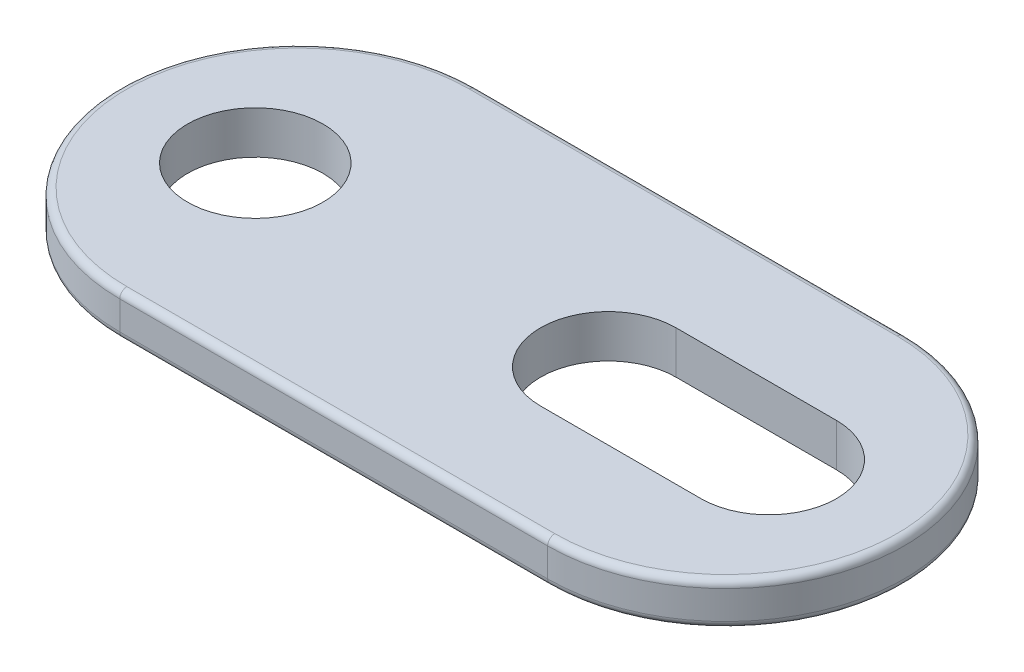
ISO-10303-21;
HEADER;
FILE_DESCRIPTION(('STEP AP214'),'2;1');
FILE_NAME('part.step','',(''),(''),'','','');
FILE_SCHEMA(('AUTOMOTIVE_DESIGN { 1 0 10303 214 1 1 1 1 }'));
ENDSEC;
DATA;
#1=APPLICATION_CONTEXT('core data for automotive mechanical design processes');
#2=APPLICATION_PROTOCOL_DEFINITION('international standard','automotive_design',2000,#1);
#3=PRODUCT_CONTEXT('',#1,'mechanical');
#4=PRODUCT('Part','Part','',(#3));
#5=PRODUCT_RELATED_PRODUCT_CATEGORY('part','',(#4));
#6=PRODUCT_DEFINITION_FORMATION('','',#4);
#7=PRODUCT_DEFINITION_CONTEXT('part definition',#1,'design');
#8=PRODUCT_DEFINITION('design','',#6,#7);
#9=PRODUCT_DEFINITION_SHAPE('','',#8);
#10=(LENGTH_UNIT() NAMED_UNIT(*) SI_UNIT(.MILLI.,.METRE.));
#11=(NAMED_UNIT(*) PLANE_ANGLE_UNIT() SI_UNIT($,.RADIAN.));
#12=(NAMED_UNIT(*) SI_UNIT($,.STERADIAN.) SOLID_ANGLE_UNIT());
#13=UNCERTAINTY_MEASURE_WITH_UNIT(LENGTH_MEASURE(1.E-05),#10,'distance_accuracy_value','');
#14=(GEOMETRIC_REPRESENTATION_CONTEXT(3) GLOBAL_UNCERTAINTY_ASSIGNED_CONTEXT((#13)) GLOBAL_UNIT_ASSIGNED_CONTEXT((#10,
#11,#12)) REPRESENTATION_CONTEXT('',''));
#15=CARTESIAN_POINT('',(0.,0.,0.));
#16=DIRECTION('',(0.,0.,1.));
#17=DIRECTION('',(1.,0.,0.));
#18=AXIS2_PLACEMENT_3D('',#15,#16,#17);
#19=CARTESIAN_POINT('',(1.524,0.762,0.));
#20=DIRECTION('',(0.,1.,0.));
#21=DIRECTION('',(0.,0.,1.));
#22=AXIS2_PLACEMENT_3D('',#19,#20,#21);
#23=PLANE('',#22);
#24=DIRECTION('',(-1.,0.,0.));
#25=VECTOR('',#24,1.);
#26=CARTESIAN_POINT('',(1.524,0.762,-6.096));
#27=LINE('',#26,#25);
#28=CARTESIAN_POINT('',(16.764,0.762,-6.096));
#29=VERTEX_POINT('',#28);
#30=CARTESIAN_POINT('',(1.524,0.762,-6.096));
#31=VERTEX_POINT('',#30);
#32=EDGE_CURVE('E49',#29,#31,#27,.T.);
#33=ORIENTED_EDGE('',*,*,#32,.T.);
#34=CARTESIAN_POINT('',(1.524,0.762,0.));
#35=DIRECTION('',(0.,1.,0.));
#36=DIRECTION('',(0.,0.,1.));
#37=AXIS2_PLACEMENT_3D('',#34,#35,#36);
#38=CIRCLE('',#37,6.096);
#39=CARTESIAN_POINT('',(1.524,0.762,6.096));
#40=VERTEX_POINT('',#39);
#41=EDGE_CURVE('E214',#31,#40,#38,.T.);
#42=ORIENTED_EDGE('',*,*,#41,.T.);
#43=DIRECTION('',(1.,0.,0.));
#44=VECTOR('',#43,1.);
#45=CARTESIAN_POINT('',(16.764,0.762,6.096));
#46=LINE('',#45,#44);
#47=CARTESIAN_POINT('',(16.764,0.762,6.096));
#48=VERTEX_POINT('',#47);
#49=EDGE_CURVE('E210',#40,#48,#46,.T.);
#50=ORIENTED_EDGE('',*,*,#49,.T.);
#51=CARTESIAN_POINT('',(16.764,0.762,0.));
#52=DIRECTION('',(0.,1.,0.));
#53=DIRECTION('',(0.,0.,1.));
#54=AXIS2_PLACEMENT_3D('',#51,#52,#53);
#55=CIRCLE('',#54,6.096);
#56=EDGE_CURVE('E54',#48,#29,#55,.T.);
#57=ORIENTED_EDGE('',*,*,#56,.T.);
#58=EDGE_LOOP('',(#33,#42,#50,#57));
#59=FACE_BOUND('',#58,.T.);
#60=CARTESIAN_POINT('',(0.,0.762,0.));
#61=DIRECTION('',(0.,1.,0.));
#62=DIRECTION('',(0.,0.,1.));
#63=AXIS2_PLACEMENT_3D('',#60,#61,#62);
#64=CIRCLE('',#63,2.413);
#65=CARTESIAN_POINT('',(0.,0.762,-2.413));
#66=VERTEX_POINT('',#65);
#67=EDGE_CURVE('E172',#66,#66,#64,.T.);
#68=ORIENTED_EDGE('',*,*,#67,.F.);
#69=EDGE_LOOP('',(#68));
#70=FACE_BOUND('',#69,.T.);
#71=DIRECTION('',(1.,0.,0.));
#72=VECTOR('',#71,1.);
#73=CARTESIAN_POINT('',(12.573,0.762,2.413));
#74=LINE('',#73,#72);
#75=CARTESIAN_POINT('',(12.573,0.762,2.413));
#76=VERTEX_POINT('',#75);
#77=CARTESIAN_POINT('',(18.288,0.762,2.413));
#78=VERTEX_POINT('',#77);
#79=EDGE_CURVE('E158',#76,#78,#74,.T.);
#80=ORIENTED_EDGE('',*,*,#79,.F.);
#81=CARTESIAN_POINT('',(12.573,0.762,0.));
#82=DIRECTION('',(0.,1.,0.));
#83=DIRECTION('',(0.,0.,1.));
#84=AXIS2_PLACEMENT_3D('',#81,#82,#83);
#85=CIRCLE('',#84,2.413);
#86=CARTESIAN_POINT('',(12.573,0.762,-2.413));
#87=VERTEX_POINT('',#86);
#88=EDGE_CURVE('E141',#87,#76,#85,.T.);
#89=ORIENTED_EDGE('',*,*,#88,.F.);
#90=DIRECTION('',(-1.,0.,0.));
#91=VECTOR('',#90,1.);
#92=CARTESIAN_POINT('',(12.573,0.762,-2.413));
#93=LINE('',#92,#91);
#94=CARTESIAN_POINT('',(18.288,0.762,-2.413));
#95=VERTEX_POINT('',#94);
#96=EDGE_CURVE('E163',#95,#87,#93,.T.);
#97=ORIENTED_EDGE('',*,*,#96,.F.);
#98=CARTESIAN_POINT('',(18.288,0.762,0.));
#99=DIRECTION('',(0.,1.,0.));
#100=DIRECTION('',(0.,0.,1.));
#101=AXIS2_PLACEMENT_3D('',#98,#99,#100);
#102=CIRCLE('',#101,2.413);
#103=EDGE_CURVE('E160',#78,#95,#102,.T.);
#104=ORIENTED_EDGE('',*,*,#103,.F.);
#105=EDGE_LOOP('',(#80,#89,#97,#104));
#106=FACE_BOUND('',#105,.T.);
#107=ADVANCED_FACE('F34',(#59,#70,#106),#23,.T.);
#108=CARTESIAN_POINT('',(1.524,-0.762,0.));
#109=DIRECTION('',(0.,1.,0.));
#110=DIRECTION('',(0.,0.,1.));
#111=AXIS2_PLACEMENT_3D('',#108,#109,#110);
#112=PLANE('',#111);
#113=DIRECTION('',(1.,0.,0.));
#114=VECTOR('',#113,1.);
#115=CARTESIAN_POINT('',(1.524,-0.762,6.096));
#116=LINE('',#115,#114);
#117=CARTESIAN_POINT('',(16.764,-0.762,6.096));
#118=VERTEX_POINT('',#117);
#119=CARTESIAN_POINT('',(1.524,-0.762,6.096));
#120=VERTEX_POINT('',#119);
#121=EDGE_CURVE('E193',#118,#120,#116,.F.);
#122=ORIENTED_EDGE('',*,*,#121,.T.);
#123=CARTESIAN_POINT('',(1.524,-0.762,0.));
#124=DIRECTION('',(0.,1.,0.));
#125=DIRECTION('',(0.,0.,1.));
#126=AXIS2_PLACEMENT_3D('',#123,#124,#125);
#127=CIRCLE('',#126,6.096);
#128=CARTESIAN_POINT('',(1.524,-0.762,-6.096));
#129=VERTEX_POINT('',#128);
#130=EDGE_CURVE('E199',#120,#129,#127,.F.);
#131=ORIENTED_EDGE('',*,*,#130,.T.);
#132=DIRECTION('',(-1.,0.,0.));
#133=VECTOR('',#132,1.);
#134=CARTESIAN_POINT('',(1.524,-0.762,-6.096));
#135=LINE('',#134,#133);
#136=CARTESIAN_POINT('',(16.764,-0.762,-6.096));
#137=VERTEX_POINT('',#136);
#138=EDGE_CURVE('E197',#129,#137,#135,.F.);
#139=ORIENTED_EDGE('',*,*,#138,.T.);
#140=CARTESIAN_POINT('',(16.764,-0.762,0.));
#141=DIRECTION('',(0.,1.,0.));
#142=DIRECTION('',(0.,0.,1.));
#143=AXIS2_PLACEMENT_3D('',#140,#141,#142);
#144=CIRCLE('',#143,6.096);
#145=EDGE_CURVE('E195',#137,#118,#144,.F.);
#146=ORIENTED_EDGE('',*,*,#145,.T.);
#147=EDGE_LOOP('',(#122,#131,#139,#146));
#148=FACE_BOUND('',#147,.T.);
#149=CARTESIAN_POINT('',(0.,-0.762,0.));
#150=DIRECTION('',(0.,1.,0.));
#151=DIRECTION('',(0.,0.,1.));
#152=AXIS2_PLACEMENT_3D('',#149,#150,#151);
#153=CIRCLE('',#152,2.413);
#154=CARTESIAN_POINT('',(0.,-0.762,-2.413));
#155=VERTEX_POINT('',#154);
#156=EDGE_CURVE('E142',#155,#155,#153,.T.);
#157=ORIENTED_EDGE('',*,*,#156,.T.);
#158=EDGE_LOOP('',(#157));
#159=FACE_BOUND('',#158,.T.);
#160=CARTESIAN_POINT('',(12.573,-0.762,0.));
#161=DIRECTION('',(0.,1.,0.));
#162=DIRECTION('',(0.,0.,1.));
#163=AXIS2_PLACEMENT_3D('',#160,#161,#162);
#164=CIRCLE('',#163,2.413);
#165=CARTESIAN_POINT('',(12.573,-0.762,-2.413));
#166=VERTEX_POINT('',#165);
#167=CARTESIAN_POINT('',(12.573,-0.762,2.413));
#168=VERTEX_POINT('',#167);
#169=EDGE_CURVE('E134',#166,#168,#164,.T.);
#170=ORIENTED_EDGE('',*,*,#169,.T.);
#171=DIRECTION('',(1.,0.,0.));
#172=VECTOR('',#171,1.);
#173=CARTESIAN_POINT('',(12.573,-0.762,2.413));
#174=LINE('',#173,#172);
#175=CARTESIAN_POINT('',(18.288,-0.762,2.413));
#176=VERTEX_POINT('',#175);
#177=EDGE_CURVE('E122',#168,#176,#174,.T.);
#178=ORIENTED_EDGE('',*,*,#177,.T.);
#179=CARTESIAN_POINT('',(18.288,-0.762,0.));
#180=DIRECTION('',(0.,1.,0.));
#181=DIRECTION('',(0.,0.,1.));
#182=AXIS2_PLACEMENT_3D('',#179,#180,#181);
#183=CIRCLE('',#182,2.413);
#184=CARTESIAN_POINT('',(18.288,-0.762,-2.413));
#185=VERTEX_POINT('',#184);
#186=EDGE_CURVE('E133',#176,#185,#183,.T.);
#187=ORIENTED_EDGE('',*,*,#186,.T.);
#188=DIRECTION('',(-1.,0.,0.));
#189=VECTOR('',#188,1.);
#190=CARTESIAN_POINT('',(12.573,-0.762,-2.413));
#191=LINE('',#190,#189);
#192=EDGE_CURVE('E147',#185,#166,#191,.T.);
#193=ORIENTED_EDGE('',*,*,#192,.T.);
#194=EDGE_LOOP('',(#170,#178,#187,#193));
#195=FACE_BOUND('',#194,.T.);
#196=ADVANCED_FACE('F145',(#148,#159,#195),#112,.F.);
#197=CARTESIAN_POINT('',(1.524,0.762,0.));
#198=DIRECTION('',(0.,-1.,0.));
#199=DIRECTION('',(0.,0.,-1.));
#200=AXIS2_PLACEMENT_3D('',#197,#198,#199);
#201=CYLINDRICAL_SURFACE('',#200,6.35);
#202=DIRECTION('',(0.,-1.,0.));
#203=VECTOR('',#202,1.);
#204=CARTESIAN_POINT('',(1.524,0.762,-6.35));
#205=LINE('',#204,#203);
#206=CARTESIAN_POINT('',(1.524,0.508,-6.35));
#207=VERTEX_POINT('',#206);
#208=CARTESIAN_POINT('',(1.524,-0.507999999999999,-6.35));
#209=VERTEX_POINT('',#208);
#210=EDGE_CURVE('E175',#207,#209,#205,.T.);
#211=ORIENTED_EDGE('',*,*,#210,.T.);
#212=CARTESIAN_POINT('',(1.524,-0.508,0.));
#213=DIRECTION('',(0.,1.,0.));
#214=DIRECTION('',(0.,0.,1.));
#215=AXIS2_PLACEMENT_3D('',#212,#213,#214);
#216=CIRCLE('',#215,6.35);
#217=CARTESIAN_POINT('',(1.524,-0.507999999999999,6.35));
#218=VERTEX_POINT('',#217);
#219=EDGE_CURVE('E190',#209,#218,#216,.T.);
#220=ORIENTED_EDGE('',*,*,#219,.T.);
#221=DIRECTION('',(0.,-1.,0.));
#222=VECTOR('',#221,1.);
#223=CARTESIAN_POINT('',(1.524,0.762,6.35));
#224=LINE('',#223,#222);
#225=CARTESIAN_POINT('',(1.524,0.508,6.35));
#226=VERTEX_POINT('',#225);
#227=EDGE_CURVE('E184',#226,#218,#224,.T.);
#228=ORIENTED_EDGE('',*,*,#227,.F.);
#229=CARTESIAN_POINT('',(1.524,0.508,0.));
#230=DIRECTION('',(0.,1.,0.));
#231=DIRECTION('',(0.,0.,1.));
#232=AXIS2_PLACEMENT_3D('',#229,#230,#231);
#233=CIRCLE('',#232,6.35);
#234=EDGE_CURVE('E187',#226,#207,#233,.F.);
#235=ORIENTED_EDGE('',*,*,#234,.T.);
#236=EDGE_LOOP('',(#211,#220,#228,#235));
#237=FACE_BOUND('',#236,.T.);
#238=ADVANCED_FACE('F36',(#237),#201,.T.);
#239=CARTESIAN_POINT('',(1.524,0.762,6.35));
#240=DIRECTION('',(0.,0.,-1.));
#241=DIRECTION('',(-1.,0.,0.));
#242=AXIS2_PLACEMENT_3D('',#239,#240,#241);
#243=PLANE('',#242);
#244=ORIENTED_EDGE('',*,*,#227,.T.);
#245=DIRECTION('',(1.,0.,0.));
#246=VECTOR('',#245,1.);
#247=CARTESIAN_POINT('',(1.524,-0.508,6.35));
#248=LINE('',#247,#246);
#249=CARTESIAN_POINT('',(16.764,-0.507999999999999,6.35));
#250=VERTEX_POINT('',#249);
#251=EDGE_CURVE('E11',#218,#250,#248,.T.);
#252=ORIENTED_EDGE('',*,*,#251,.T.);
#253=DIRECTION('',(0.,-1.,0.));
#254=VECTOR('',#253,1.);
#255=CARTESIAN_POINT('',(16.764,0.762,6.35));
#256=LINE('',#255,#254);
#257=CARTESIAN_POINT('',(16.764,0.508,6.35));
#258=VERTEX_POINT('',#257);
#259=EDGE_CURVE('E181',#258,#250,#256,.T.);
#260=ORIENTED_EDGE('',*,*,#259,.F.);
#261=DIRECTION('',(1.,0.,0.));
#262=VECTOR('',#261,1.);
#263=CARTESIAN_POINT('',(1.524,0.508,6.35));
#264=LINE('',#263,#262);
#265=EDGE_CURVE('E42',#258,#226,#264,.F.);
#266=ORIENTED_EDGE('',*,*,#265,.T.);
#267=EDGE_LOOP('',(#244,#252,#260,#266));
#268=FACE_BOUND('',#267,.T.);
#269=ADVANCED_FACE('F219',(#268),#243,.F.);
#270=CARTESIAN_POINT('',(16.764,0.762,0.));
#271=DIRECTION('',(0.,-1.,0.));
#272=DIRECTION('',(0.,0.,-1.));
#273=AXIS2_PLACEMENT_3D('',#270,#271,#272);
#274=CYLINDRICAL_SURFACE('',#273,6.35);
#275=ORIENTED_EDGE('',*,*,#259,.T.);
#276=CARTESIAN_POINT('',(16.764,-0.508,0.));
#277=DIRECTION('',(0.,1.,0.));
#278=DIRECTION('',(0.,0.,1.));
#279=AXIS2_PLACEMENT_3D('',#276,#277,#278);
#280=CIRCLE('',#279,6.35);
#281=CARTESIAN_POINT('',(16.764,-0.507999999999999,-6.35));
#282=VERTEX_POINT('',#281);
#283=EDGE_CURVE('E208',#250,#282,#280,.T.);
#284=ORIENTED_EDGE('',*,*,#283,.T.);
#285=DIRECTION('',(0.,-1.,0.));
#286=VECTOR('',#285,1.);
#287=CARTESIAN_POINT('',(16.764,0.762,-6.35));
#288=LINE('',#287,#286);
#289=CARTESIAN_POINT('',(16.764,0.508,-6.35));
#290=VERTEX_POINT('',#289);
#291=EDGE_CURVE('E178',#290,#282,#288,.T.);
#292=ORIENTED_EDGE('',*,*,#291,.F.);
#293=CARTESIAN_POINT('',(16.764,0.508,0.));
#294=DIRECTION('',(0.,1.,0.));
#295=DIRECTION('',(0.,0.,1.));
#296=AXIS2_PLACEMENT_3D('',#293,#294,#295);
#297=CIRCLE('',#296,6.35);
#298=EDGE_CURVE('E206',#290,#258,#297,.F.);
#299=ORIENTED_EDGE('',*,*,#298,.T.);
#300=EDGE_LOOP('',(#275,#284,#292,#299));
#301=FACE_BOUND('',#300,.T.);
#302=ADVANCED_FACE('F262',(#301),#274,.T.);
#303=CARTESIAN_POINT('',(1.524,0.762,-6.35));
#304=DIRECTION('',(0.,0.,1.));
#305=DIRECTION('',(1.,0.,0.));
#306=AXIS2_PLACEMENT_3D('',#303,#304,#305);
#307=PLANE('',#306);
#308=ORIENTED_EDGE('',*,*,#291,.T.);
#309=DIRECTION('',(-1.,0.,0.));
#310=VECTOR('',#309,1.);
#311=CARTESIAN_POINT('',(1.524,-0.508,-6.35));
#312=LINE('',#311,#310);
#313=EDGE_CURVE('E204',#282,#209,#312,.T.);
#314=ORIENTED_EDGE('',*,*,#313,.T.);
#315=ORIENTED_EDGE('',*,*,#210,.F.);
#316=DIRECTION('',(-1.,0.,0.));
#317=VECTOR('',#316,1.);
#318=CARTESIAN_POINT('',(16.764,0.508,-6.35));
#319=LINE('',#318,#317);
#320=EDGE_CURVE('E202',#207,#290,#319,.F.);
#321=ORIENTED_EDGE('',*,*,#320,.T.);
#322=EDGE_LOOP('',(#308,#314,#315,#321));
#323=FACE_BOUND('',#322,.T.);
#324=ADVANCED_FACE('F265',(#323),#307,.F.);
#325=CARTESIAN_POINT('',(0.,0.762,0.));
#326=DIRECTION('',(0.,-1.,0.));
#327=DIRECTION('',(0.,0.,-1.));
#328=AXIS2_PLACEMENT_3D('',#325,#326,#327);
#329=CYLINDRICAL_SURFACE('',#328,2.413);
#330=CARTESIAN_POINT('',(0.,0.762,-2.413));
#331=CARTESIAN_POINT('',(0.,0.746125,-2.413));
#332=CARTESIAN_POINT('',(0.,0.73025,-2.413));
#333=CARTESIAN_POINT('',(0.,0.6985,-2.413));
#334=CARTESIAN_POINT('',(0.,0.682625,-2.413));
#335=CARTESIAN_POINT('',(0.,0.650875,-2.413));
#336=CARTESIAN_POINT('',(0.,0.635,-2.413));
#337=CARTESIAN_POINT('',(0.,0.60325,-2.413));
#338=CARTESIAN_POINT('',(0.,0.587375,-2.413));
#339=CARTESIAN_POINT('',(0.,0.555625,-2.413));
#340=CARTESIAN_POINT('',(0.,0.53975,-2.413));
#341=CARTESIAN_POINT('',(0.,0.508,-2.413));
#342=CARTESIAN_POINT('',(0.,0.492125,-2.413));
#343=CARTESIAN_POINT('',(0.,0.460375,-2.413));
#344=CARTESIAN_POINT('',(0.,0.4445,-2.413));
#345=CARTESIAN_POINT('',(0.,0.41275,-2.413));
#346=CARTESIAN_POINT('',(0.,0.396875,-2.413));
#347=CARTESIAN_POINT('',(0.,0.365125,-2.413));
#348=CARTESIAN_POINT('',(0.,0.34925,-2.413));
#349=CARTESIAN_POINT('',(0.,0.3175,-2.413));
#350=CARTESIAN_POINT('',(0.,0.301625,-2.413));
#351=CARTESIAN_POINT('',(0.,0.269875,-2.413));
#352=CARTESIAN_POINT('',(0.,0.254,-2.413));
#353=CARTESIAN_POINT('',(0.,0.22225,-2.413));
#354=CARTESIAN_POINT('',(0.,0.206375,-2.413));
#355=CARTESIAN_POINT('',(0.,0.174625,-2.413));
#356=CARTESIAN_POINT('',(0.,0.15875,-2.413));
#357=CARTESIAN_POINT('',(0.,0.127,-2.413));
#358=CARTESIAN_POINT('',(0.,0.111125,-2.413));
#359=CARTESIAN_POINT('',(0.,0.0793749999999999,-2.413));
#360=CARTESIAN_POINT('',(0.,0.0634999999999999,-2.413));
#361=CARTESIAN_POINT('',(0.,0.0317499999999999,-2.413));
#362=CARTESIAN_POINT('',(0.,0.0158749999999999,-2.413));
#363=CARTESIAN_POINT('',(0.,-0.0158750000000001,-2.413));
#364=CARTESIAN_POINT('',(0.,-0.0317500000000001,-2.413));
#365=CARTESIAN_POINT('',(0.,-0.0635000000000002,-2.413));
#366=CARTESIAN_POINT('',(0.,-0.0793750000000002,-2.413));
#367=CARTESIAN_POINT('',(0.,-0.111125,-2.413));
#368=CARTESIAN_POINT('',(0.,-0.127,-2.413));
#369=CARTESIAN_POINT('',(0.,-0.15875,-2.413));
#370=CARTESIAN_POINT('',(0.,-0.174625,-2.413));
#371=CARTESIAN_POINT('',(0.,-0.206375,-2.413));
#372=CARTESIAN_POINT('',(0.,-0.22225,-2.413));
#373=CARTESIAN_POINT('',(0.,-0.254,-2.413));
#374=CARTESIAN_POINT('',(0.,-0.269875,-2.413));
#375=CARTESIAN_POINT('',(0.,-0.301625,-2.413));
#376=CARTESIAN_POINT('',(0.,-0.3175,-2.413));
#377=CARTESIAN_POINT('',(0.,-0.34925,-2.413));
#378=CARTESIAN_POINT('',(0.,-0.365125,-2.413));
#379=CARTESIAN_POINT('',(0.,-0.396875,-2.413));
#380=CARTESIAN_POINT('',(0.,-0.41275,-2.413));
#381=CARTESIAN_POINT('',(0.,-0.4445,-2.413));
#382=CARTESIAN_POINT('',(0.,-0.460375,-2.413));
#383=CARTESIAN_POINT('',(0.,-0.492125,-2.413));
#384=CARTESIAN_POINT('',(0.,-0.508,-2.413));
#385=CARTESIAN_POINT('',(0.,-0.53975,-2.413));
#386=CARTESIAN_POINT('',(0.,-0.555625,-2.413));
#387=CARTESIAN_POINT('',(0.,-0.587375,-2.413));
#388=CARTESIAN_POINT('',(0.,-0.60325,-2.413));
#389=CARTESIAN_POINT('',(0.,-0.635,-2.413));
#390=CARTESIAN_POINT('',(0.,-0.650875,-2.413));
#391=CARTESIAN_POINT('',(0.,-0.682625,-2.413));
#392=CARTESIAN_POINT('',(0.,-0.6985,-2.413));
#393=CARTESIAN_POINT('',(0.,-0.73025,-2.413));
#394=CARTESIAN_POINT('',(0.,-0.746125,-2.413));
#395=CARTESIAN_POINT('',(0.,-0.762,-2.413));
#396=B_SPLINE_CURVE_WITH_KNOTS('',3,(#330,#331,#332,#333,#334,#335,#336,#337,#338,#339,#340,
#341,#342,#343,#344,#345,#346,#347,#348,#349,#350,#351,#352,#353,#354,#355,#356,#357,#358,#359,
#360,#361,#362,#363,#364,#365,#366,#367,#368,#369,#370,#371,#372,#373,#374,#375,#376,#377,#378,
#379,#380,#381,#382,#383,#384,#385,#386,#387,#388,#389,#390,#391,#392,#393,#394,#395),
.UNSPECIFIED.,.F.,.F.,(4,2,2,2,2,2,2,2,2,2,2,2,2,2,2,2,2,2,2,2,2,2,2,2,2,2,2,2,2,2,2,2,4),(0.,
0.0476249999999999,0.09525,0.142875,0.1905,0.238125,0.28575,0.333375,0.381,0.428625,0.47625,
0.523875,0.5715,0.619125,0.66675,0.714375,0.762,0.809625,0.85725,0.904875,0.9525,1.000125,
1.04775,1.095375,1.143,1.190625,1.23825,1.285875,1.3335,1.381125,1.42875,1.476375,1.524),.UNSPECIFIED.);
#397=EDGE_CURVE('BSEAM292',#66,#155,#396,.T.);
#398=ORIENTED_EDGE('',*,*,#67,.T.);
#399=ORIENTED_EDGE('',*,*,#156,.F.);
#400=ORIENTED_EDGE('',*,*,#397,.T.);
#401=ORIENTED_EDGE('',*,*,#397,.F.);
#402=EDGE_LOOP('',(#398,#400,#399,#401));
#403=FACE_BOUND('',#402,.T.);
#404=ADVANCED_FACE('F292',(#403),#329,.F.);
#405=CARTESIAN_POINT('',(12.573,0.762,0.));
#406=DIRECTION('',(0.,-1.,0.));
#407=DIRECTION('',(0.,0.,-1.));
#408=AXIS2_PLACEMENT_3D('',#405,#406,#407);
#409=CYLINDRICAL_SURFACE('',#408,2.413);
#410=ORIENTED_EDGE('',*,*,#169,.F.);
#411=DIRECTION('',(0.,-1.,0.));
#412=VECTOR('',#411,1.);
#413=CARTESIAN_POINT('',(12.573,0.762,-2.413));
#414=LINE('',#413,#412);
#415=EDGE_CURVE('E165',#87,#166,#414,.T.);
#416=ORIENTED_EDGE('',*,*,#415,.F.);
#417=ORIENTED_EDGE('',*,*,#88,.T.);
#418=DIRECTION('',(0.,-1.,0.));
#419=VECTOR('',#418,1.);
#420=CARTESIAN_POINT('',(12.573,0.762,2.413));
#421=LINE('',#420,#419);
#422=EDGE_CURVE('E125',#76,#168,#421,.T.);
#423=ORIENTED_EDGE('',*,*,#422,.T.);
#424=EDGE_LOOP('',(#410,#416,#417,#423));
#425=FACE_BOUND('',#424,.T.);
#426=ADVANCED_FACE('F137',(#425),#409,.F.);
#427=CARTESIAN_POINT('',(12.573,0.762,2.413));
#428=DIRECTION('',(0.,0.,-1.));
#429=DIRECTION('',(-1.,0.,0.));
#430=AXIS2_PLACEMENT_3D('',#427,#428,#429);
#431=PLANE('',#430);
#432=ORIENTED_EDGE('',*,*,#177,.F.);
#433=ORIENTED_EDGE('',*,*,#422,.F.);
#434=ORIENTED_EDGE('',*,*,#79,.T.);
#435=DIRECTION('',(0.,-1.,0.));
#436=VECTOR('',#435,1.);
#437=CARTESIAN_POINT('',(18.288,0.762,2.413));
#438=LINE('',#437,#436);
#439=EDGE_CURVE('E128',#78,#176,#438,.T.);
#440=ORIENTED_EDGE('',*,*,#439,.T.);
#441=EDGE_LOOP('',(#432,#433,#434,#440));
#442=FACE_BOUND('',#441,.T.);
#443=ADVANCED_FACE('F124',(#442),#431,.T.);
#444=CARTESIAN_POINT('',(18.288,0.762,0.));
#445=DIRECTION('',(0.,-1.,0.));
#446=DIRECTION('',(0.,0.,-1.));
#447=AXIS2_PLACEMENT_3D('',#444,#445,#446);
#448=CYLINDRICAL_SURFACE('',#447,2.413);
#449=ORIENTED_EDGE('',*,*,#186,.F.);
#450=ORIENTED_EDGE('',*,*,#439,.F.);
#451=ORIENTED_EDGE('',*,*,#103,.T.);
#452=DIRECTION('',(0.,-1.,0.));
#453=VECTOR('',#452,1.);
#454=CARTESIAN_POINT('',(18.288,0.762,-2.413));
#455=LINE('',#454,#453);
#456=EDGE_CURVE('E167',#95,#185,#455,.T.);
#457=ORIENTED_EDGE('',*,*,#456,.T.);
#458=EDGE_LOOP('',(#449,#450,#451,#457));
#459=FACE_BOUND('',#458,.T.);
#460=ADVANCED_FACE('F318',(#459),#448,.F.);
#461=CARTESIAN_POINT('',(12.573,0.762,-2.413));
#462=DIRECTION('',(0.,0.,1.));
#463=DIRECTION('',(1.,0.,0.));
#464=AXIS2_PLACEMENT_3D('',#461,#462,#463);
#465=PLANE('',#464);
#466=ORIENTED_EDGE('',*,*,#192,.F.);
#467=ORIENTED_EDGE('',*,*,#456,.F.);
#468=ORIENTED_EDGE('',*,*,#96,.T.);
#469=ORIENTED_EDGE('',*,*,#415,.T.);
#470=EDGE_LOOP('',(#466,#467,#468,#469));
#471=FACE_BOUND('',#470,.T.);
#472=ADVANCED_FACE('F313',(#471),#465,.T.);
#473=CARTESIAN_POINT('',(16.764,-0.508,0.));
#474=DIRECTION('',(0.,1.,0.));
#475=DIRECTION('',(0.,0.,1.));
#476=AXIS2_PLACEMENT_3D('',#473,#474,#475);
#477=TOROIDAL_SURFACE('',#476,6.096,0.254);
#478=CARTESIAN_POINT('',(16.764,-0.508,6.096));
#479=DIRECTION('',(-1.,0.,0.));
#480=DIRECTION('',(0.,0.,1.));
#481=AXIS2_PLACEMENT_3D('',#478,#479,#480);
#482=CIRCLE('',#481,0.254);
#483=EDGE_CURVE('E151',#118,#250,#482,.T.);
#484=ORIENTED_EDGE('',*,*,#483,.F.);
#485=ORIENTED_EDGE('',*,*,#145,.F.);
#486=CARTESIAN_POINT('',(16.764,-0.508,-6.096));
#487=DIRECTION('',(-1.,0.,0.));
#488=DIRECTION('',(0.,0.,1.));
#489=AXIS2_PLACEMENT_3D('',#486,#487,#488);
#490=CIRCLE('',#489,0.254);
#491=EDGE_CURVE('E148',#282,#137,#490,.T.);
#492=ORIENTED_EDGE('',*,*,#491,.F.);
#493=ORIENTED_EDGE('',*,*,#283,.F.);
#494=EDGE_LOOP('',(#484,#485,#492,#493));
#495=FACE_BOUND('',#494,.T.);
#496=ADVANCED_FACE('F257',(#495),#477,.T.);
#497=CARTESIAN_POINT('',(1.524,-0.508,-6.096));
#498=DIRECTION('',(-1.,0.,0.));
#499=DIRECTION('',(0.,0.,1.));
#500=AXIS2_PLACEMENT_3D('',#497,#498,#499);
#501=CYLINDRICAL_SURFACE('',#500,0.254);
#502=ORIENTED_EDGE('',*,*,#491,.T.);
#503=ORIENTED_EDGE('',*,*,#138,.F.);
#504=CARTESIAN_POINT('',(1.524,-0.508,-6.096));
#505=DIRECTION('',(-1.,0.,0.));
#506=DIRECTION('',(0.,0.,1.));
#507=AXIS2_PLACEMENT_3D('',#504,#505,#506);
#508=CIRCLE('',#507,0.254);
#509=EDGE_CURVE('E246',#209,#129,#508,.T.);
#510=ORIENTED_EDGE('',*,*,#509,.F.);
#511=ORIENTED_EDGE('',*,*,#313,.F.);
#512=EDGE_LOOP('',(#502,#503,#510,#511));
#513=FACE_BOUND('',#512,.T.);
#514=ADVANCED_FACE('F379',(#513),#501,.T.);
#515=CARTESIAN_POINT('',(1.524,-0.508,6.096));
#516=DIRECTION('',(1.,0.,0.));
#517=DIRECTION('',(0.,0.,-1.));
#518=AXIS2_PLACEMENT_3D('',#515,#516,#517);
#519=CYLINDRICAL_SURFACE('',#518,0.254);
#520=ORIENTED_EDGE('',*,*,#483,.T.);
#521=ORIENTED_EDGE('',*,*,#251,.F.);
#522=CARTESIAN_POINT('',(1.524,-0.508,6.096));
#523=DIRECTION('',(-1.,0.,0.));
#524=DIRECTION('',(0.,0.,1.));
#525=AXIS2_PLACEMENT_3D('',#522,#523,#524);
#526=CIRCLE('',#525,0.254);
#527=EDGE_CURVE('E244',#120,#218,#526,.T.);
#528=ORIENTED_EDGE('',*,*,#527,.F.);
#529=ORIENTED_EDGE('',*,*,#121,.F.);
#530=EDGE_LOOP('',(#520,#521,#528,#529));
#531=FACE_BOUND('',#530,.T.);
#532=ADVANCED_FACE('F252',(#531),#519,.T.);
#533=CARTESIAN_POINT('',(1.524,-0.508,0.));
#534=DIRECTION('',(0.,1.,0.));
#535=DIRECTION('',(0.,0.,1.));
#536=AXIS2_PLACEMENT_3D('',#533,#534,#535);
#537=TOROIDAL_SURFACE('',#536,6.096,0.254);
#538=ORIENTED_EDGE('',*,*,#509,.T.);
#539=ORIENTED_EDGE('',*,*,#130,.F.);
#540=ORIENTED_EDGE('',*,*,#527,.T.);
#541=ORIENTED_EDGE('',*,*,#219,.F.);
#542=EDGE_LOOP('',(#538,#539,#540,#541));
#543=FACE_BOUND('',#542,.T.);
#544=ADVANCED_FACE('F271',(#543),#537,.T.);
#545=CARTESIAN_POINT('',(16.764,0.508,0.));
#546=DIRECTION('',(0.,1.,0.));
#547=DIRECTION('',(0.,0.,1.));
#548=AXIS2_PLACEMENT_3D('',#545,#546,#547);
#549=TOROIDAL_SURFACE('',#548,6.096,0.254);
#550=CARTESIAN_POINT('',(16.764,0.508,6.096));
#551=DIRECTION('',(-1.,0.,0.));
#552=DIRECTION('',(0.,0.,1.));
#553=AXIS2_PLACEMENT_3D('',#550,#551,#552);
#554=CIRCLE('',#553,0.254);
#555=EDGE_CURVE('E237',#258,#48,#554,.T.);
#556=ORIENTED_EDGE('',*,*,#555,.F.);
#557=ORIENTED_EDGE('',*,*,#298,.F.);
#558=CARTESIAN_POINT('',(16.764,0.508,-6.096));
#559=DIRECTION('',(-1.,0.,0.));
#560=DIRECTION('',(0.,0.,1.));
#561=AXIS2_PLACEMENT_3D('',#558,#559,#560);
#562=CIRCLE('',#561,0.254);
#563=EDGE_CURVE('E241',#29,#290,#562,.T.);
#564=ORIENTED_EDGE('',*,*,#563,.F.);
#565=ORIENTED_EDGE('',*,*,#56,.F.);
#566=EDGE_LOOP('',(#556,#557,#564,#565));
#567=FACE_BOUND('',#566,.T.);
#568=ADVANCED_FACE('F269',(#567),#549,.T.);
#569=CARTESIAN_POINT('',(1.524,0.508,-6.096));
#570=DIRECTION('',(1.,0.,0.));
#571=DIRECTION('',(0.,0.,-1.));
#572=AXIS2_PLACEMENT_3D('',#569,#570,#571);
#573=CYLINDRICAL_SURFACE('',#572,0.254);
#574=ORIENTED_EDGE('',*,*,#563,.T.);
#575=ORIENTED_EDGE('',*,*,#320,.F.);
#576=CARTESIAN_POINT('',(1.524,0.508,-6.096));
#577=DIRECTION('',(-1.,0.,0.));
#578=DIRECTION('',(0.,0.,1.));
#579=AXIS2_PLACEMENT_3D('',#576,#577,#578);
#580=CIRCLE('',#579,0.254);
#581=EDGE_CURVE('E233',#31,#207,#580,.T.);
#582=ORIENTED_EDGE('',*,*,#581,.F.);
#583=ORIENTED_EDGE('',*,*,#32,.F.);
#584=EDGE_LOOP('',(#574,#575,#582,#583));
#585=FACE_BOUND('',#584,.T.);
#586=ADVANCED_FACE('F267',(#585),#573,.T.);
#587=CARTESIAN_POINT('',(1.524,0.508,6.096));
#588=DIRECTION('',(-1.,0.,0.));
#589=DIRECTION('',(0.,0.,1.));
#590=AXIS2_PLACEMENT_3D('',#587,#588,#589);
#591=CYLINDRICAL_SURFACE('',#590,0.254);
#592=ORIENTED_EDGE('',*,*,#555,.T.);
#593=ORIENTED_EDGE('',*,*,#49,.F.);
#594=CARTESIAN_POINT('',(1.524,0.508,6.096));
#595=DIRECTION('',(-1.,0.,0.));
#596=DIRECTION('',(0.,0.,1.));
#597=AXIS2_PLACEMENT_3D('',#594,#595,#596);
#598=CIRCLE('',#597,0.254);
#599=EDGE_CURVE('E231',#226,#40,#598,.T.);
#600=ORIENTED_EDGE('',*,*,#599,.F.);
#601=ORIENTED_EDGE('',*,*,#265,.F.);
#602=EDGE_LOOP('',(#592,#593,#600,#601));
#603=FACE_BOUND('',#602,.T.);
#604=ADVANCED_FACE('F235',(#603),#591,.T.);
#605=CARTESIAN_POINT('',(1.524,0.508,0.));
#606=DIRECTION('',(0.,1.,0.));
#607=DIRECTION('',(0.,0.,1.));
#608=AXIS2_PLACEMENT_3D('',#605,#606,#607);
#609=TOROIDAL_SURFACE('',#608,6.096,0.254);
#610=ORIENTED_EDGE('',*,*,#581,.T.);
#611=ORIENTED_EDGE('',*,*,#234,.F.);
#612=ORIENTED_EDGE('',*,*,#599,.T.);
#613=ORIENTED_EDGE('',*,*,#41,.F.);
#614=EDGE_LOOP('',(#610,#611,#612,#613));
#615=FACE_BOUND('',#614,.T.);
#616=ADVANCED_FACE('F229',(#615),#609,.T.);
#617=CLOSED_SHELL('',(#107,#196,#238,#269,#302,#324,#404,#426,#443,#460,#472,#496,#514,#532,
#544,#568,#586,#604,#616));
#618=MANIFOLD_SOLID_BREP('B2',#617);
#619=ADVANCED_BREP_SHAPE_REPRESENTATION('',(#18,#618),#14);
#620=SHAPE_DEFINITION_REPRESENTATION(#9,#619);
ENDSEC;
END-ISO-10303-21;
